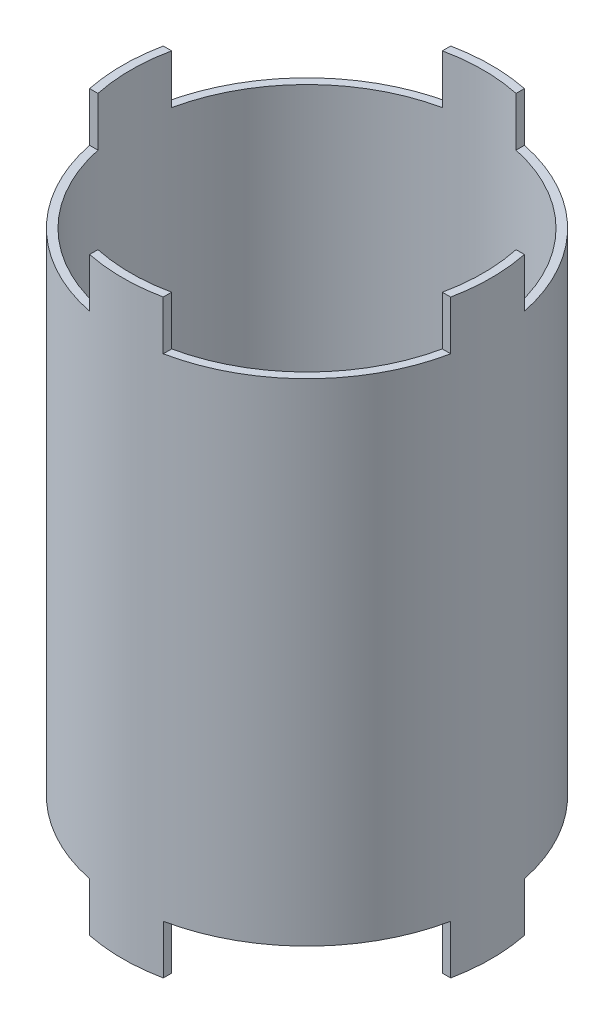
ISO-10303-21;
HEADER;
FILE_DESCRIPTION(('STEP AP214'),'2;1');
FILE_NAME('part.step','',(''),(''),'','','');
FILE_SCHEMA(('AUTOMOTIVE_DESIGN { 1 0 10303 214 1 1 1 1 }'));
ENDSEC;
DATA;
#1=APPLICATION_CONTEXT('core data for automotive mechanical design processes');
#2=APPLICATION_PROTOCOL_DEFINITION('international standard','automotive_design',2000,#1);
#3=PRODUCT_CONTEXT('',#1,'mechanical');
#4=PRODUCT('Part','Part','',(#3));
#5=PRODUCT_RELATED_PRODUCT_CATEGORY('part','',(#4));
#6=PRODUCT_DEFINITION_FORMATION('','',#4);
#7=PRODUCT_DEFINITION_CONTEXT('part definition',#1,'design');
#8=PRODUCT_DEFINITION('design','',#6,#7);
#9=PRODUCT_DEFINITION_SHAPE('','',#8);
#10=(LENGTH_UNIT() NAMED_UNIT(*) SI_UNIT(.MILLI.,.METRE.));
#11=(NAMED_UNIT(*) PLANE_ANGLE_UNIT() SI_UNIT($,.RADIAN.));
#12=(NAMED_UNIT(*) SI_UNIT($,.STERADIAN.) SOLID_ANGLE_UNIT());
#13=UNCERTAINTY_MEASURE_WITH_UNIT(LENGTH_MEASURE(1.E-05),#10,'distance_accuracy_value','');
#14=(GEOMETRIC_REPRESENTATION_CONTEXT(3) GLOBAL_UNCERTAINTY_ASSIGNED_CONTEXT((#13)) GLOBAL_UNIT_ASSIGNED_CONTEXT((#10,
#11,#12)) REPRESENTATION_CONTEXT('',''));
#15=CARTESIAN_POINT('',(0.,0.,0.));
#16=DIRECTION('',(0.,0.,1.));
#17=DIRECTION('',(1.,0.,0.));
#18=AXIS2_PLACEMENT_3D('',#15,#16,#17);
#19=CARTESIAN_POINT('',(0.,0.,0.));
#20=DIRECTION('',(0.,1.,0.));
#21=DIRECTION('',(0.,0.,1.));
#22=AXIS2_PLACEMENT_3D('',#19,#20,#21);
#23=PLANE('',#22);
#24=CARTESIAN_POINT('',(0.,0.,0.));
#25=DIRECTION('',(0.,1.,0.));
#26=DIRECTION('',(0.,0.,1.));
#27=AXIS2_PLACEMENT_3D('',#24,#25,#26);
#28=CIRCLE('',#27,54.61);
#29=CARTESIAN_POINT('',(-53.4004419457367,0.,11.43));
#30=VERTEX_POINT('',#29);
#31=CARTESIAN_POINT('',(-11.43,0.,53.4004419457367));
#32=VERTEX_POINT('',#31);
#33=EDGE_CURVE('E255',#30,#32,#28,.T.);
#34=ORIENTED_EDGE('',*,*,#33,.T.);
#35=DIRECTION('',(0.,0.,1.));
#36=VECTOR('',#35,1.);
#37=CARTESIAN_POINT('',(-11.43,0.,53.4004419457368));
#38=LINE('',#37,#36);
#39=CARTESIAN_POINT('',(-11.43,0.,55.9953355200235));
#40=VERTEX_POINT('',#39);
#41=EDGE_CURVE('E58',#32,#40,#38,.T.);
#42=ORIENTED_EDGE('',*,*,#41,.T.);
#43=CARTESIAN_POINT('',(0.,0.,0.));
#44=DIRECTION('',(0.,1.,0.));
#45=DIRECTION('',(0.,0.,1.));
#46=AXIS2_PLACEMENT_3D('',#43,#44,#45);
#47=CIRCLE('',#46,57.15);
#48=CARTESIAN_POINT('',(-55.9953355200235,0.,11.43));
#49=VERTEX_POINT('',#48);
#50=EDGE_CURVE('E502',#49,#40,#47,.T.);
#51=ORIENTED_EDGE('',*,*,#50,.F.);
#52=DIRECTION('',(1.,0.,0.));
#53=VECTOR('',#52,1.);
#54=CARTESIAN_POINT('',(-55.9953355200235,0.,11.43));
#55=LINE('',#54,#53);
#56=EDGE_CURVE('E327',#49,#30,#55,.T.);
#57=ORIENTED_EDGE('',*,*,#56,.T.);
#58=EDGE_LOOP('',(#34,#42,#51,#57));
#59=FACE_BOUND('',#58,.T.);
#60=ADVANCED_FACE('F33',(#59),#23,.F.);
#61=DIRECTION('',(1.,0.,0.));
#62=VECTOR('',#61,1.);
#63=CARTESIAN_POINT('',(53.4004419457368,0.,-11.43));
#64=LINE('',#63,#62);
#65=CARTESIAN_POINT('',(53.4004419457368,0.,-11.43));
#66=VERTEX_POINT('',#65);
#67=CARTESIAN_POINT('',(55.9953355200235,0.,-11.43));
#68=VERTEX_POINT('',#67);
#69=EDGE_CURVE('E299',#66,#68,#64,.T.);
#70=ORIENTED_EDGE('',*,*,#69,.F.);
#71=CARTESIAN_POINT('',(11.43,0.,-53.4004419457367));
#72=VERTEX_POINT('',#71);
#73=EDGE_CURVE('E256',#66,#72,#28,.T.);
#74=ORIENTED_EDGE('',*,*,#73,.T.);
#75=DIRECTION('',(0.,0.,-1.));
#76=VECTOR('',#75,1.);
#77=CARTESIAN_POINT('',(11.43,0.,-53.4004419457368));
#78=LINE('',#77,#76);
#79=CARTESIAN_POINT('',(11.43,0.,-55.9953355200235));
#80=VERTEX_POINT('',#79);
#81=EDGE_CURVE('E331',#72,#80,#78,.T.);
#82=ORIENTED_EDGE('',*,*,#81,.T.);
#83=EDGE_CURVE('E477',#68,#80,#47,.T.);
#84=ORIENTED_EDGE('',*,*,#83,.F.);
#85=EDGE_LOOP('',(#70,#74,#82,#84));
#86=FACE_BOUND('',#85,.T.);
#87=ADVANCED_FACE('F484',(#86),#23,.F.);
#88=DIRECTION('',(1.,0.,0.));
#89=VECTOR('',#88,1.);
#90=CARTESIAN_POINT('',(-55.9953355200235,0.,-11.43));
#91=LINE('',#90,#89);
#92=CARTESIAN_POINT('',(-55.9953355200235,0.,-11.43));
#93=VERTEX_POINT('',#92);
#94=CARTESIAN_POINT('',(-53.4004419457367,0.,-11.43));
#95=VERTEX_POINT('',#94);
#96=EDGE_CURVE('E324',#93,#95,#91,.T.);
#97=ORIENTED_EDGE('',*,*,#96,.F.);
#98=CARTESIAN_POINT('',(-11.43,0.,-55.9953355200235));
#99=VERTEX_POINT('',#98);
#100=EDGE_CURVE('E37',#99,#93,#47,.T.);
#101=ORIENTED_EDGE('',*,*,#100,.F.);
#102=DIRECTION('',(0.,0.,-1.));
#103=VECTOR('',#102,1.);
#104=CARTESIAN_POINT('',(-11.43,0.,-53.4004419457368));
#105=LINE('',#104,#103);
#106=CARTESIAN_POINT('',(-11.43,0.,-53.4004419457367));
#107=VERTEX_POINT('',#106);
#108=EDGE_CURVE('E344',#107,#99,#105,.T.);
#109=ORIENTED_EDGE('',*,*,#108,.F.);
#110=EDGE_CURVE('E258',#107,#95,#28,.T.);
#111=ORIENTED_EDGE('',*,*,#110,.T.);
#112=EDGE_LOOP('',(#97,#101,#109,#111));
#113=FACE_BOUND('',#112,.T.);
#114=ADVANCED_FACE('F538',(#113),#23,.F.);
#115=CARTESIAN_POINT('',(0.,152.4,0.));
#116=DIRECTION('',(0.,1.,0.));
#117=DIRECTION('',(0.,0.,1.));
#118=AXIS2_PLACEMENT_3D('',#115,#116,#117);
#119=PLANE('',#118);
#120=CARTESIAN_POINT('',(0.,152.4,0.));
#121=DIRECTION('',(0.,1.,0.));
#122=DIRECTION('',(0.,0.,1.));
#123=AXIS2_PLACEMENT_3D('',#120,#121,#122);
#124=CIRCLE('',#123,57.15);
#125=CARTESIAN_POINT('',(-55.9953355200235,152.4,11.43));
#126=VERTEX_POINT('',#125);
#127=CARTESIAN_POINT('',(-11.43,152.4,55.9953355200235));
#128=VERTEX_POINT('',#127);
#129=EDGE_CURVE('E11',#126,#128,#124,.T.);
#130=ORIENTED_EDGE('',*,*,#129,.T.);
#131=DIRECTION('',(0.,0.,1.));
#132=VECTOR('',#131,1.);
#133=CARTESIAN_POINT('',(-11.43,152.4,53.4004419457368));
#134=LINE('',#133,#132);
#135=CARTESIAN_POINT('',(-11.43,152.4,53.4004419457368));
#136=VERTEX_POINT('',#135);
#137=EDGE_CURVE('E379',#136,#128,#134,.T.);
#138=ORIENTED_EDGE('',*,*,#137,.F.);
#139=CARTESIAN_POINT('',(0.,152.4,0.));
#140=DIRECTION('',(0.,1.,0.));
#141=DIRECTION('',(0.,0.,1.));
#142=AXIS2_PLACEMENT_3D('',#139,#140,#141);
#143=CIRCLE('',#142,54.61);
#144=CARTESIAN_POINT('',(-53.4004419457368,152.4,11.43));
#145=VERTEX_POINT('',#144);
#146=EDGE_CURVE('E475',#145,#136,#143,.T.);
#147=ORIENTED_EDGE('',*,*,#146,.F.);
#148=DIRECTION('',(-1.,0.,0.));
#149=VECTOR('',#148,1.);
#150=CARTESIAN_POINT('',(-53.4004419457368,152.4,11.43));
#151=LINE('',#150,#149);
#152=EDGE_CURVE('E452',#145,#126,#151,.T.);
#153=ORIENTED_EDGE('',*,*,#152,.T.);
#154=EDGE_LOOP('',(#130,#138,#147,#153));
#155=FACE_BOUND('',#154,.T.);
#156=ADVANCED_FACE('F549',(#155),#119,.T.);
#157=DIRECTION('',(-0.00627212040273388,0.,0.999980330059374));
#158=VECTOR('',#157,1.);
#159=CARTESIAN_POINT('',(11.43,152.4,53.4004419457368));
#160=LINE('',#159,#158);
#161=CARTESIAN_POINT('',(11.43,152.4,53.4004419457367));
#162=VERTEX_POINT('',#161);
#163=CARTESIAN_POINT('',(11.4137033455449,152.4,55.9986595905643));
#164=VERTEX_POINT('',#163);
#165=EDGE_CURVE('E381',#162,#164,#160,.T.);
#166=ORIENTED_EDGE('',*,*,#165,.T.);
#167=CARTESIAN_POINT('',(55.9953355200235,152.4,11.43));
#168=VERTEX_POINT('',#167);
#169=EDGE_CURVE('E42',#164,#168,#124,.T.);
#170=ORIENTED_EDGE('',*,*,#169,.T.);
#171=DIRECTION('',(1.,0.,0.));
#172=VECTOR('',#171,1.);
#173=CARTESIAN_POINT('',(53.4004419457368,152.4,11.43));
#174=LINE('',#173,#172);
#175=CARTESIAN_POINT('',(53.4004419457368,152.4,11.43));
#176=VERTEX_POINT('',#175);
#177=EDGE_CURVE('E405',#176,#168,#174,.T.);
#178=ORIENTED_EDGE('',*,*,#177,.F.);
#179=EDGE_CURVE('E478',#162,#176,#143,.T.);
#180=ORIENTED_EDGE('',*,*,#179,.F.);
#181=EDGE_LOOP('',(#166,#170,#178,#180));
#182=FACE_BOUND('',#181,.T.);
#183=ADVANCED_FACE('F554',(#182),#119,.T.);
#184=DIRECTION('',(1.,0.,0.));
#185=VECTOR('',#184,1.);
#186=CARTESIAN_POINT('',(53.4004419457368,152.4,-11.43));
#187=LINE('',#186,#185);
#188=CARTESIAN_POINT('',(53.4004419457367,152.4,-11.43));
#189=VERTEX_POINT('',#188);
#190=CARTESIAN_POINT('',(55.9953355200235,152.4,-11.43));
#191=VERTEX_POINT('',#190);
#192=EDGE_CURVE('E408',#189,#191,#187,.T.);
#193=ORIENTED_EDGE('',*,*,#192,.T.);
#194=CARTESIAN_POINT('',(11.43,152.4,-55.9953355200235));
#195=VERTEX_POINT('',#194);
#196=EDGE_CURVE('E879',#191,#195,#124,.T.);
#197=ORIENTED_EDGE('',*,*,#196,.T.);
#198=DIRECTION('',(0.,0.,-1.));
#199=VECTOR('',#198,1.);
#200=CARTESIAN_POINT('',(11.43,152.4,-53.4004419457368));
#201=LINE('',#200,#199);
#202=CARTESIAN_POINT('',(11.43,152.4,-53.4004419457368));
#203=VERTEX_POINT('',#202);
#204=EDGE_CURVE('E432',#203,#195,#201,.T.);
#205=ORIENTED_EDGE('',*,*,#204,.F.);
#206=EDGE_CURVE('E481',#189,#203,#143,.T.);
#207=ORIENTED_EDGE('',*,*,#206,.F.);
#208=EDGE_LOOP('',(#193,#197,#205,#207));
#209=FACE_BOUND('',#208,.T.);
#210=ADVANCED_FACE('F547',(#209),#119,.T.);
#211=DIRECTION('',(0.,0.,-1.));
#212=VECTOR('',#211,1.);
#213=CARTESIAN_POINT('',(-11.43,152.4,-53.4004419457368));
#214=LINE('',#213,#212);
#215=CARTESIAN_POINT('',(-11.43,152.4,-53.4004419457367));
#216=VERTEX_POINT('',#215);
#217=CARTESIAN_POINT('',(-11.43,152.4,-55.9953355200235));
#218=VERTEX_POINT('',#217);
#219=EDGE_CURVE('E435',#216,#218,#214,.T.);
#220=ORIENTED_EDGE('',*,*,#219,.T.);
#221=CARTESIAN_POINT('',(-55.9953355200235,152.4,-11.43));
#222=VERTEX_POINT('',#221);
#223=EDGE_CURVE('E43',#218,#222,#124,.T.);
#224=ORIENTED_EDGE('',*,*,#223,.T.);
#225=DIRECTION('',(1.,0.,0.));
#226=VECTOR('',#225,1.);
#227=CARTESIAN_POINT('',(-55.9953355200235,152.4,-11.43));
#228=LINE('',#227,#226);
#229=CARTESIAN_POINT('',(-53.4004419457368,152.4,-11.43));
#230=VERTEX_POINT('',#229);
#231=EDGE_CURVE('E439',#222,#230,#228,.T.);
#232=ORIENTED_EDGE('',*,*,#231,.T.);
#233=EDGE_CURVE('E479',#216,#230,#143,.T.);
#234=ORIENTED_EDGE('',*,*,#233,.F.);
#235=EDGE_LOOP('',(#220,#224,#232,#234));
#236=FACE_BOUND('',#235,.T.);
#237=ADVANCED_FACE('F541',(#236),#119,.T.);
#238=CARTESIAN_POINT('',(11.43,0.,55.9953355200235));
#239=VERTEX_POINT('',#238);
#240=CARTESIAN_POINT('',(55.9953355200235,0.,11.43));
#241=VERTEX_POINT('',#240);
#242=EDGE_CURVE('E50',#239,#241,#47,.T.);
#243=ORIENTED_EDGE('',*,*,#242,.F.);
#244=DIRECTION('',(0.,0.,-1.));
#245=VECTOR('',#244,1.);
#246=CARTESIAN_POINT('',(11.43,0.,55.9953355200235));
#247=LINE('',#246,#245);
#248=CARTESIAN_POINT('',(11.43,0.,53.4004419457368));
#249=VERTEX_POINT('',#248);
#250=EDGE_CURVE('E260',#239,#249,#247,.T.);
#251=ORIENTED_EDGE('',*,*,#250,.T.);
#252=CARTESIAN_POINT('',(53.4004419457367,0.,11.43));
#253=VERTEX_POINT('',#252);
#254=EDGE_CURVE('E245',#249,#253,#28,.T.);
#255=ORIENTED_EDGE('',*,*,#254,.T.);
#256=DIRECTION('',(1.,0.,0.));
#257=VECTOR('',#256,1.);
#258=CARTESIAN_POINT('',(53.4004419457368,0.,11.43));
#259=LINE('',#258,#257);
#260=EDGE_CURVE('E297',#253,#241,#259,.T.);
#261=ORIENTED_EDGE('',*,*,#260,.T.);
#262=EDGE_LOOP('',(#243,#251,#255,#261));
#263=FACE_BOUND('',#262,.T.);
#264=ADVANCED_FACE('F261',(#263),#23,.F.);
#265=CARTESIAN_POINT('',(0.,152.4,0.));
#266=DIRECTION('',(0.,-1.,0.));
#267=DIRECTION('',(0.,0.,-1.));
#268=AXIS2_PLACEMENT_3D('',#265,#266,#267);
#269=CYLINDRICAL_SURFACE('',#268,57.15);
#270=ORIENTED_EDGE('',*,*,#129,.F.);
#271=DIRECTION('',(0.,-1.,0.));
#272=VECTOR('',#271,1.);
#273=CARTESIAN_POINT('',(-55.9953355200235,167.64,11.43));
#274=LINE('',#273,#272);
#275=CARTESIAN_POINT('',(-55.9953355200235,167.64,11.43));
#276=VERTEX_POINT('',#275);
#277=EDGE_CURVE('E469',#276,#126,#274,.T.);
#278=ORIENTED_EDGE('',*,*,#277,.F.);
#279=CARTESIAN_POINT('',(0.,167.64,0.));
#280=DIRECTION('',(0.,-1.,0.));
#281=DIRECTION('',(0.,0.,-1.));
#282=AXIS2_PLACEMENT_3D('',#279,#280,#281);
#283=CIRCLE('',#282,57.15);
#284=CARTESIAN_POINT('',(-55.9953355200235,167.64,-11.43));
#285=VERTEX_POINT('',#284);
#286=EDGE_CURVE('E458',#276,#285,#283,.T.);
#287=ORIENTED_EDGE('',*,*,#286,.T.);
#288=DIRECTION('',(0.,-1.,0.));
#289=VECTOR('',#288,1.);
#290=CARTESIAN_POINT('',(-55.9953355200235,167.64,-11.43));
#291=LINE('',#290,#289);
#292=EDGE_CURVE('E466',#285,#222,#291,.T.);
#293=ORIENTED_EDGE('',*,*,#292,.T.);
#294=ORIENTED_EDGE('',*,*,#223,.F.);
#295=DIRECTION('',(0.,-1.,0.));
#296=VECTOR('',#295,1.);
#297=CARTESIAN_POINT('',(-11.43,167.64,-55.9953355200235));
#298=LINE('',#297,#296);
#299=CARTESIAN_POINT('',(-11.43,167.64,-55.9953355200235));
#300=VERTEX_POINT('',#299);
#301=EDGE_CURVE('E421',#300,#218,#298,.T.);
#302=ORIENTED_EDGE('',*,*,#301,.F.);
#303=CARTESIAN_POINT('',(0.,167.64,0.));
#304=DIRECTION('',(0.,-1.,0.));
#305=DIRECTION('',(0.,0.,-1.));
#306=AXIS2_PLACEMENT_3D('',#303,#304,#305);
#307=CIRCLE('',#306,57.15);
#308=CARTESIAN_POINT('',(11.43,167.64,-55.9953355200235));
#309=VERTEX_POINT('',#308);
#310=EDGE_CURVE('E443',#300,#309,#307,.T.);
#311=ORIENTED_EDGE('',*,*,#310,.T.);
#312=DIRECTION('',(0.,-1.,0.));
#313=VECTOR('',#312,1.);
#314=CARTESIAN_POINT('',(11.43,167.64,-55.9953355200235));
#315=LINE('',#314,#313);
#316=EDGE_CURVE('E424',#309,#195,#315,.T.);
#317=ORIENTED_EDGE('',*,*,#316,.T.);
#318=ORIENTED_EDGE('',*,*,#196,.F.);
#319=DIRECTION('',(0.,-1.,0.));
#320=VECTOR('',#319,1.);
#321=CARTESIAN_POINT('',(55.9953355200235,167.64,-11.43));
#322=LINE('',#321,#320);
#323=CARTESIAN_POINT('',(55.9953355200235,167.64,-11.43));
#324=VERTEX_POINT('',#323);
#325=EDGE_CURVE('E394',#324,#191,#322,.T.);
#326=ORIENTED_EDGE('',*,*,#325,.F.);
#327=CARTESIAN_POINT('',(0.,167.64,0.));
#328=DIRECTION('',(0.,-1.,0.));
#329=DIRECTION('',(0.,0.,-1.));
#330=AXIS2_PLACEMENT_3D('',#327,#328,#329);
#331=CIRCLE('',#330,57.15);
#332=CARTESIAN_POINT('',(55.9953355200235,167.64,11.43));
#333=VERTEX_POINT('',#332);
#334=EDGE_CURVE('E416',#324,#333,#331,.T.);
#335=ORIENTED_EDGE('',*,*,#334,.T.);
#336=DIRECTION('',(0.,-1.,0.));
#337=VECTOR('',#336,1.);
#338=CARTESIAN_POINT('',(55.9953355200235,167.64,11.43));
#339=LINE('',#338,#337);
#340=EDGE_CURVE('E397',#333,#168,#339,.T.);
#341=ORIENTED_EDGE('',*,*,#340,.T.);
#342=ORIENTED_EDGE('',*,*,#169,.F.);
#343=DIRECTION('',(0.,-1.,0.));
#344=VECTOR('',#343,1.);
#345=CARTESIAN_POINT('',(11.4137033455449,167.64,55.9986595905643));
#346=LINE('',#345,#344);
#347=CARTESIAN_POINT('',(11.4137033455449,167.64,55.9986595905643));
#348=VERTEX_POINT('',#347);
#349=EDGE_CURVE('E373',#348,#164,#346,.T.);
#350=ORIENTED_EDGE('',*,*,#349,.F.);
#351=CARTESIAN_POINT('',(0.,167.64,0.));
#352=DIRECTION('',(0.,1.,0.));
#353=DIRECTION('',(0.,0.,1.));
#354=AXIS2_PLACEMENT_3D('',#351,#352,#353);
#355=CIRCLE('',#354,57.15);
#356=CARTESIAN_POINT('',(-11.43,167.64,55.9953355200235));
#357=VERTEX_POINT('',#356);
#358=EDGE_CURVE('E387',#357,#348,#355,.T.);
#359=ORIENTED_EDGE('',*,*,#358,.F.);
#360=DIRECTION('',(0.,-1.,0.));
#361=VECTOR('',#360,1.);
#362=CARTESIAN_POINT('',(-11.43,167.64,55.9953355200235));
#363=LINE('',#362,#361);
#364=EDGE_CURVE('E375',#357,#128,#363,.T.);
#365=ORIENTED_EDGE('',*,*,#364,.T.);
#366=EDGE_LOOP('',(#270,#278,#287,#293,#294,#302,#311,#317,#318,#326,#335,#341,#342,#350,#359,#365));
#367=FACE_BOUND('',#366,.T.);
#368=ORIENTED_EDGE('',*,*,#100,.T.);
#369=DIRECTION('',(0.,1.,0.));
#370=VECTOR('',#369,1.);
#371=CARTESIAN_POINT('',(-55.9953355200235,-15.24,-11.43));
#372=LINE('',#371,#370);
#373=CARTESIAN_POINT('',(-55.9953355200235,-15.24,-11.43));
#374=VERTEX_POINT('',#373);
#375=EDGE_CURVE('E319',#374,#93,#372,.T.);
#376=ORIENTED_EDGE('',*,*,#375,.F.);
#377=CARTESIAN_POINT('',(0.,-15.24,0.));
#378=DIRECTION('',(0.,-1.,0.));
#379=DIRECTION('',(0.,0.,-1.));
#380=AXIS2_PLACEMENT_3D('',#377,#378,#379);
#381=CIRCLE('',#380,57.15);
#382=CARTESIAN_POINT('',(-55.9953355200235,-15.24,11.43));
#383=VERTEX_POINT('',#382);
#384=EDGE_CURVE('E315',#383,#374,#381,.T.);
#385=ORIENTED_EDGE('',*,*,#384,.F.);
#386=DIRECTION('',(0.,1.,0.));
#387=VECTOR('',#386,1.);
#388=CARTESIAN_POINT('',(-55.9953355200235,-15.24,11.43));
#389=LINE('',#388,#387);
#390=EDGE_CURVE('E303',#383,#49,#389,.T.);
#391=ORIENTED_EDGE('',*,*,#390,.T.);
#392=ORIENTED_EDGE('',*,*,#50,.T.);
#393=DIRECTION('',(0.,1.,0.));
#394=VECTOR('',#393,1.);
#395=CARTESIAN_POINT('',(-11.43,-15.24,55.9953355200235));
#396=LINE('',#395,#394);
#397=CARTESIAN_POINT('',(-11.43,-15.24,55.9953355200235));
#398=VERTEX_POINT('',#397);
#399=EDGE_CURVE('E271',#398,#40,#396,.T.);
#400=ORIENTED_EDGE('',*,*,#399,.F.);
#401=CARTESIAN_POINT('',(0.,-15.24,0.));
#402=DIRECTION('',(0.,1.,0.));
#403=DIRECTION('',(0.,0.,1.));
#404=AXIS2_PLACEMENT_3D('',#401,#402,#403);
#405=CIRCLE('',#404,57.15);
#406=CARTESIAN_POINT('',(11.43,-15.24,55.9953355200235));
#407=VERTEX_POINT('',#406);
#408=EDGE_CURVE('E282',#398,#407,#405,.T.);
#409=ORIENTED_EDGE('',*,*,#408,.T.);
#410=DIRECTION('',(0.,1.,0.));
#411=VECTOR('',#410,1.);
#412=CARTESIAN_POINT('',(11.43,-15.24,55.9953355200235));
#413=LINE('',#412,#411);
#414=EDGE_CURVE('E268',#407,#239,#413,.T.);
#415=ORIENTED_EDGE('',*,*,#414,.T.);
#416=ORIENTED_EDGE('',*,*,#242,.T.);
#417=DIRECTION('',(0.,1.,0.));
#418=VECTOR('',#417,1.);
#419=CARTESIAN_POINT('',(55.9953355200235,-15.24,11.43));
#420=LINE('',#419,#418);
#421=CARTESIAN_POINT('',(55.9953355200235,-15.24,11.43));
#422=VERTEX_POINT('',#421);
#423=EDGE_CURVE('E289',#422,#241,#420,.T.);
#424=ORIENTED_EDGE('',*,*,#423,.F.);
#425=CARTESIAN_POINT('',(0.,-15.24,0.));
#426=DIRECTION('',(0.,-1.,0.));
#427=DIRECTION('',(0.,0.,-1.));
#428=AXIS2_PLACEMENT_3D('',#425,#426,#427);
#429=CIRCLE('',#428,57.15);
#430=CARTESIAN_POINT('',(55.9953355200235,-15.24,-11.43));
#431=VERTEX_POINT('',#430);
#432=EDGE_CURVE('E308',#431,#422,#429,.T.);
#433=ORIENTED_EDGE('',*,*,#432,.F.);
#434=DIRECTION('',(0.,1.,0.));
#435=VECTOR('',#434,1.);
#436=CARTESIAN_POINT('',(55.9953355200235,-15.24,-11.43));
#437=LINE('',#436,#435);
#438=EDGE_CURVE('E278',#431,#68,#437,.T.);
#439=ORIENTED_EDGE('',*,*,#438,.T.);
#440=ORIENTED_EDGE('',*,*,#83,.T.);
#441=DIRECTION('',(0.,1.,0.));
#442=VECTOR('',#441,1.);
#443=CARTESIAN_POINT('',(11.43,-15.24,-55.9953355200235));
#444=LINE('',#443,#442);
#445=CARTESIAN_POINT('',(11.43,-15.24,-55.9953355200235));
#446=VERTEX_POINT('',#445);
#447=EDGE_CURVE('E352',#446,#80,#444,.T.);
#448=ORIENTED_EDGE('',*,*,#447,.F.);
#449=CARTESIAN_POINT('',(0.,-15.24,0.));
#450=DIRECTION('',(0.,1.,0.));
#451=DIRECTION('',(0.,0.,1.));
#452=AXIS2_PLACEMENT_3D('',#449,#450,#451);
#453=CIRCLE('',#452,57.15);
#454=CARTESIAN_POINT('',(-11.43,-15.24,-55.9953355200235));
#455=VERTEX_POINT('',#454);
#456=EDGE_CURVE('E343',#446,#455,#453,.T.);
#457=ORIENTED_EDGE('',*,*,#456,.T.);
#458=DIRECTION('',(0.,1.,0.));
#459=VECTOR('',#458,1.);
#460=CARTESIAN_POINT('',(-11.43,-15.24,-55.9953355200235));
#461=LINE('',#460,#459);
#462=EDGE_CURVE('E364',#455,#99,#461,.T.);
#463=ORIENTED_EDGE('',*,*,#462,.T.);
#464=EDGE_LOOP('',(#368,#376,#385,#391,#392,#400,#409,#415,#416,#424,#433,#439,#440,#448,#457,#463));
#465=FACE_BOUND('',#464,.T.);
#466=ADVANCED_FACE('F35',(#367,#465),#269,.T.);
#467=CARTESIAN_POINT('',(0.,152.4,0.));
#468=DIRECTION('',(0.,-1.,0.));
#469=DIRECTION('',(0.,0.,-1.));
#470=AXIS2_PLACEMENT_3D('',#467,#468,#469);
#471=CYLINDRICAL_SURFACE('',#470,54.61);
#472=ORIENTED_EDGE('',*,*,#146,.T.);
#473=DIRECTION('',(0.,-1.,0.));
#474=VECTOR('',#473,1.);
#475=CARTESIAN_POINT('',(-11.43,167.64,53.4004419457368));
#476=LINE('',#475,#474);
#477=CARTESIAN_POINT('',(-11.43,167.64,53.4004419457368));
#478=VERTEX_POINT('',#477);
#479=EDGE_CURVE('E360',#478,#136,#476,.T.);
#480=ORIENTED_EDGE('',*,*,#479,.F.);
#481=CARTESIAN_POINT('',(0.,167.64,0.));
#482=DIRECTION('',(0.,1.,0.));
#483=DIRECTION('',(0.,0.,1.));
#484=AXIS2_PLACEMENT_3D('',#481,#482,#483);
#485=CIRCLE('',#484,54.61);
#486=CARTESIAN_POINT('',(11.43,167.64,53.4004419457368));
#487=VERTEX_POINT('',#486);
#488=EDGE_CURVE('E382',#478,#487,#485,.T.);
#489=ORIENTED_EDGE('',*,*,#488,.T.);
#490=DIRECTION('',(0.,-1.,0.));
#491=VECTOR('',#490,1.);
#492=CARTESIAN_POINT('',(11.43,167.64,53.4004419457368));
#493=LINE('',#492,#491);
#494=EDGE_CURVE('E369',#487,#162,#493,.T.);
#495=ORIENTED_EDGE('',*,*,#494,.T.);
#496=ORIENTED_EDGE('',*,*,#179,.T.);
#497=DIRECTION('',(0.,-1.,0.));
#498=VECTOR('',#497,1.);
#499=CARTESIAN_POINT('',(53.4004419457368,167.64,11.43));
#500=LINE('',#499,#498);
#501=CARTESIAN_POINT('',(53.4004419457368,167.64,11.43));
#502=VERTEX_POINT('',#501);
#503=EDGE_CURVE('E400',#502,#176,#500,.T.);
#504=ORIENTED_EDGE('',*,*,#503,.F.);
#505=CARTESIAN_POINT('',(0.,167.64,0.));
#506=DIRECTION('',(0.,-1.,0.));
#507=DIRECTION('',(0.,0.,-1.));
#508=AXIS2_PLACEMENT_3D('',#505,#506,#507);
#509=CIRCLE('',#508,54.61);
#510=CARTESIAN_POINT('',(53.4004419457368,167.64,-11.43));
#511=VERTEX_POINT('',#510);
#512=EDGE_CURVE('E396',#511,#502,#509,.T.);
#513=ORIENTED_EDGE('',*,*,#512,.F.);
#514=DIRECTION('',(0.,-1.,0.));
#515=VECTOR('',#514,1.);
#516=CARTESIAN_POINT('',(53.4004419457368,167.64,-11.43));
#517=LINE('',#516,#515);
#518=EDGE_CURVE('E385',#511,#189,#517,.T.);
#519=ORIENTED_EDGE('',*,*,#518,.T.);
#520=ORIENTED_EDGE('',*,*,#206,.T.);
#521=DIRECTION('',(0.,-1.,0.));
#522=VECTOR('',#521,1.);
#523=CARTESIAN_POINT('',(11.43,167.64,-53.4004419457368));
#524=LINE('',#523,#522);
#525=CARTESIAN_POINT('',(11.43,167.64,-53.4004419457368));
#526=VERTEX_POINT('',#525);
#527=EDGE_CURVE('E427',#526,#203,#524,.T.);
#528=ORIENTED_EDGE('',*,*,#527,.F.);
#529=CARTESIAN_POINT('',(0.,167.64,0.));
#530=DIRECTION('',(0.,-1.,0.));
#531=DIRECTION('',(0.,0.,-1.));
#532=AXIS2_PLACEMENT_3D('',#529,#530,#531);
#533=CIRCLE('',#532,54.61);
#534=CARTESIAN_POINT('',(-11.43,167.64,-53.4004419457368));
#535=VERTEX_POINT('',#534);
#536=EDGE_CURVE('E423',#535,#526,#533,.T.);
#537=ORIENTED_EDGE('',*,*,#536,.F.);
#538=DIRECTION('',(0.,-1.,0.));
#539=VECTOR('',#538,1.);
#540=CARTESIAN_POINT('',(-11.43,167.64,-53.4004419457368));
#541=LINE('',#540,#539);
#542=EDGE_CURVE('E412',#535,#216,#541,.T.);
#543=ORIENTED_EDGE('',*,*,#542,.T.);
#544=ORIENTED_EDGE('',*,*,#233,.T.);
#545=DIRECTION('',(0.,-1.,0.));
#546=VECTOR('',#545,1.);
#547=CARTESIAN_POINT('',(-53.4004419457368,167.64,-11.43));
#548=LINE('',#547,#546);
#549=CARTESIAN_POINT('',(-53.4004419457368,167.64,-11.43));
#550=VERTEX_POINT('',#549);
#551=EDGE_CURVE('E461',#550,#230,#548,.T.);
#552=ORIENTED_EDGE('',*,*,#551,.F.);
#553=CARTESIAN_POINT('',(0.,167.64,0.));
#554=DIRECTION('',(0.,1.,0.));
#555=DIRECTION('',(0.,0.,1.));
#556=AXIS2_PLACEMENT_3D('',#553,#554,#555);
#557=CIRCLE('',#556,54.61);
#558=CARTESIAN_POINT('',(-53.4004419457368,167.64,11.43));
#559=VERTEX_POINT('',#558);
#560=EDGE_CURVE('E451',#550,#559,#557,.T.);
#561=ORIENTED_EDGE('',*,*,#560,.T.);
#562=DIRECTION('',(0.,-1.,0.));
#563=VECTOR('',#562,1.);
#564=CARTESIAN_POINT('',(-53.4004419457368,167.64,11.43));
#565=LINE('',#564,#563);
#566=EDGE_CURVE('E471',#559,#145,#565,.T.);
#567=ORIENTED_EDGE('',*,*,#566,.T.);
#568=EDGE_LOOP('',(#472,#480,#489,#495,#496,#504,#513,#519,#520,#528,#537,#543,#544,#552,#561,#567));
#569=FACE_BOUND('',#568,.T.);
#570=ORIENTED_EDGE('',*,*,#110,.F.);
#571=DIRECTION('',(0.,1.,0.));
#572=VECTOR('',#571,1.);
#573=CARTESIAN_POINT('',(-11.43,-15.24,-53.4004419457368));
#574=LINE('',#573,#572);
#575=CARTESIAN_POINT('',(-11.43,-15.24,-53.4004419457368));
#576=VERTEX_POINT('',#575);
#577=EDGE_CURVE('E361',#576,#107,#574,.T.);
#578=ORIENTED_EDGE('',*,*,#577,.F.);
#579=CARTESIAN_POINT('',(0.,-15.24,0.));
#580=DIRECTION('',(0.,-1.,0.));
#581=DIRECTION('',(0.,0.,-1.));
#582=AXIS2_PLACEMENT_3D('',#579,#580,#581);
#583=CIRCLE('',#582,54.61);
#584=CARTESIAN_POINT('',(11.43,-15.24,-53.4004419457368));
#585=VERTEX_POINT('',#584);
#586=EDGE_CURVE('E349',#576,#585,#583,.T.);
#587=ORIENTED_EDGE('',*,*,#586,.T.);
#588=DIRECTION('',(0.,1.,0.));
#589=VECTOR('',#588,1.);
#590=CARTESIAN_POINT('',(11.43,-15.24,-53.4004419457368));
#591=LINE('',#590,#589);
#592=EDGE_CURVE('E357',#585,#72,#591,.T.);
#593=ORIENTED_EDGE('',*,*,#592,.T.);
#594=ORIENTED_EDGE('',*,*,#73,.F.);
#595=DIRECTION('',(0.,1.,0.));
#596=VECTOR('',#595,1.);
#597=CARTESIAN_POINT('',(53.4004419457368,-15.24,-11.43));
#598=LINE('',#597,#596);
#599=CARTESIAN_POINT('',(53.4004419457368,-15.24,-11.43));
#600=VERTEX_POINT('',#599);
#601=EDGE_CURVE('E293',#600,#66,#598,.T.);
#602=ORIENTED_EDGE('',*,*,#601,.F.);
#603=CARTESIAN_POINT('',(0.,-15.24,0.));
#604=DIRECTION('',(0.,-1.,0.));
#605=DIRECTION('',(0.,0.,-1.));
#606=AXIS2_PLACEMENT_3D('',#603,#604,#605);
#607=CIRCLE('',#606,54.61);
#608=CARTESIAN_POINT('',(53.4004419457368,-15.24,11.43));
#609=VERTEX_POINT('',#608);
#610=EDGE_CURVE('E296',#600,#609,#607,.T.);
#611=ORIENTED_EDGE('',*,*,#610,.T.);
#612=DIRECTION('',(0.,1.,0.));
#613=VECTOR('',#612,1.);
#614=CARTESIAN_POINT('',(53.4004419457368,-15.24,11.43));
#615=LINE('',#614,#613);
#616=EDGE_CURVE('E253',#609,#253,#615,.T.);
#617=ORIENTED_EDGE('',*,*,#616,.T.);
#618=ORIENTED_EDGE('',*,*,#254,.F.);
#619=DIRECTION('',(0.,1.,0.));
#620=VECTOR('',#619,1.);
#621=CARTESIAN_POINT('',(11.43,-15.24,53.4004419457368));
#622=LINE('',#621,#620);
#623=CARTESIAN_POINT('',(11.43,-15.24,53.4004419457368));
#624=VERTEX_POINT('',#623);
#625=EDGE_CURVE('E250',#624,#249,#622,.T.);
#626=ORIENTED_EDGE('',*,*,#625,.F.);
#627=CARTESIAN_POINT('',(0.,-15.24,0.));
#628=DIRECTION('',(0.,1.,0.));
#629=DIRECTION('',(0.,0.,1.));
#630=AXIS2_PLACEMENT_3D('',#627,#628,#629);
#631=CIRCLE('',#630,54.61);
#632=CARTESIAN_POINT('',(-11.43,-15.24,53.4004419457368));
#633=VERTEX_POINT('',#632);
#634=EDGE_CURVE('E279',#633,#624,#631,.T.);
#635=ORIENTED_EDGE('',*,*,#634,.F.);
#636=DIRECTION('',(0.,1.,0.));
#637=VECTOR('',#636,1.);
#638=CARTESIAN_POINT('',(-11.43,-15.24,53.4004419457368));
#639=LINE('',#638,#637);
#640=EDGE_CURVE('E269',#633,#32,#639,.T.);
#641=ORIENTED_EDGE('',*,*,#640,.T.);
#642=ORIENTED_EDGE('',*,*,#33,.F.);
#643=DIRECTION('',(0.,1.,0.));
#644=VECTOR('',#643,1.);
#645=CARTESIAN_POINT('',(-53.4004419457367,-15.24,11.43));
#646=LINE('',#645,#644);
#647=CARTESIAN_POINT('',(-53.4004419457367,-15.24,11.43));
#648=VERTEX_POINT('',#647);
#649=EDGE_CURVE('E312',#648,#30,#646,.T.);
#650=ORIENTED_EDGE('',*,*,#649,.F.);
#651=CARTESIAN_POINT('',(0.,-15.24,0.));
#652=DIRECTION('',(0.,-1.,0.));
#653=DIRECTION('',(0.,0.,-1.));
#654=AXIS2_PLACEMENT_3D('',#651,#652,#653);
#655=CIRCLE('',#654,54.61);
#656=CARTESIAN_POINT('',(-53.4004419457367,-15.24,-11.43));
#657=VERTEX_POINT('',#656);
#658=EDGE_CURVE('E335',#648,#657,#655,.T.);
#659=ORIENTED_EDGE('',*,*,#658,.T.);
#660=DIRECTION('',(0.,1.,0.));
#661=VECTOR('',#660,1.);
#662=CARTESIAN_POINT('',(-53.4004419457367,-15.24,-11.43));
#663=LINE('',#662,#661);
#664=EDGE_CURVE('E316',#657,#95,#663,.T.);
#665=ORIENTED_EDGE('',*,*,#664,.T.);
#666=EDGE_LOOP('',(#570,#578,#587,#593,#594,#602,#611,#617,#618,#626,#635,#641,#642,#650,#659,#665));
#667=FACE_BOUND('',#666,.T.);
#668=ADVANCED_FACE('F247',(#569,#667),#471,.F.);
#669=CARTESIAN_POINT('',(-55.9953355200235,167.64,-11.43));
#670=DIRECTION('',(0.,0.,-1.));
#671=DIRECTION('',(-1.,0.,0.));
#672=AXIS2_PLACEMENT_3D('',#669,#670,#671);
#673=PLANE('',#672);
#674=ORIENTED_EDGE('',*,*,#231,.F.);
#675=ORIENTED_EDGE('',*,*,#292,.F.);
#676=DIRECTION('',(1.,0.,0.));
#677=VECTOR('',#676,1.);
#678=CARTESIAN_POINT('',(-55.9953355200235,167.64,-11.43));
#679=LINE('',#678,#677);
#680=EDGE_CURVE('E448',#285,#550,#679,.T.);
#681=ORIENTED_EDGE('',*,*,#680,.T.);
#682=ORIENTED_EDGE('',*,*,#551,.T.);
#683=EDGE_LOOP('',(#674,#675,#681,#682));
#684=FACE_BOUND('',#683,.T.);
#685=ADVANCED_FACE('F563',(#684),#673,.T.);
#686=CARTESIAN_POINT('',(-53.4004419457368,167.64,11.43));
#687=DIRECTION('',(0.,0.,1.));
#688=DIRECTION('',(1.,0.,0.));
#689=AXIS2_PLACEMENT_3D('',#686,#687,#688);
#690=PLANE('',#689);
#691=ORIENTED_EDGE('',*,*,#152,.F.);
#692=ORIENTED_EDGE('',*,*,#566,.F.);
#693=DIRECTION('',(-1.,0.,0.));
#694=VECTOR('',#693,1.);
#695=CARTESIAN_POINT('',(-53.4004419457368,167.64,11.43));
#696=LINE('',#695,#694);
#697=EDGE_CURVE('E455',#559,#276,#696,.T.);
#698=ORIENTED_EDGE('',*,*,#697,.T.);
#699=ORIENTED_EDGE('',*,*,#277,.T.);
#700=EDGE_LOOP('',(#691,#692,#698,#699));
#701=FACE_BOUND('',#700,.T.);
#702=ADVANCED_FACE('F567',(#701),#690,.T.);
#703=CARTESIAN_POINT('',(0.,167.64,0.));
#704=DIRECTION('',(0.,1.,0.));
#705=DIRECTION('',(0.,0.,1.));
#706=AXIS2_PLACEMENT_3D('',#703,#704,#705);
#707=PLANE('',#706);
#708=ORIENTED_EDGE('',*,*,#680,.F.);
#709=ORIENTED_EDGE('',*,*,#286,.F.);
#710=ORIENTED_EDGE('',*,*,#697,.F.);
#711=ORIENTED_EDGE('',*,*,#560,.F.);
#712=EDGE_LOOP('',(#708,#709,#710,#711));
#713=FACE_BOUND('',#712,.T.);
#714=ADVANCED_FACE('F571',(#713),#707,.T.);
#715=CARTESIAN_POINT('',(-11.43,167.64,-53.4004419457368));
#716=DIRECTION('',(-1.,0.,0.));
#717=DIRECTION('',(0.,0.,1.));
#718=AXIS2_PLACEMENT_3D('',#715,#716,#717);
#719=PLANE('',#718);
#720=ORIENTED_EDGE('',*,*,#219,.F.);
#721=ORIENTED_EDGE('',*,*,#542,.F.);
#722=DIRECTION('',(0.,0.,-1.));
#723=VECTOR('',#722,1.);
#724=CARTESIAN_POINT('',(-11.43,167.64,-53.4004419457368));
#725=LINE('',#724,#723);
#726=EDGE_CURVE('E436',#535,#300,#725,.T.);
#727=ORIENTED_EDGE('',*,*,#726,.T.);
#728=ORIENTED_EDGE('',*,*,#301,.T.);
#729=EDGE_LOOP('',(#720,#721,#727,#728));
#730=FACE_BOUND('',#729,.T.);
#731=ADVANCED_FACE('F575',(#730),#719,.T.);
#732=CARTESIAN_POINT('',(11.43,167.64,-53.4004419457368));
#733=DIRECTION('',(-1.,0.,0.));
#734=DIRECTION('',(0.,0.,1.));
#735=AXIS2_PLACEMENT_3D('',#732,#733,#734);
#736=PLANE('',#735);
#737=ORIENTED_EDGE('',*,*,#204,.T.);
#738=ORIENTED_EDGE('',*,*,#316,.F.);
#739=DIRECTION('',(0.,0.,-1.));
#740=VECTOR('',#739,1.);
#741=CARTESIAN_POINT('',(11.43,167.64,-53.4004419457368));
#742=LINE('',#741,#740);
#743=EDGE_CURVE('E441',#526,#309,#742,.T.);
#744=ORIENTED_EDGE('',*,*,#743,.F.);
#745=ORIENTED_EDGE('',*,*,#527,.T.);
#746=EDGE_LOOP('',(#737,#738,#744,#745));
#747=FACE_BOUND('',#746,.T.);
#748=ADVANCED_FACE('F581',(#747),#736,.F.);
#749=CARTESIAN_POINT('',(0.,167.64,0.));
#750=DIRECTION('',(0.,-1.,0.));
#751=DIRECTION('',(0.,0.,-1.));
#752=AXIS2_PLACEMENT_3D('',#749,#750,#751);
#753=PLANE('',#752);
#754=ORIENTED_EDGE('',*,*,#726,.F.);
#755=ORIENTED_EDGE('',*,*,#536,.T.);
#756=ORIENTED_EDGE('',*,*,#743,.T.);
#757=ORIENTED_EDGE('',*,*,#310,.F.);
#758=EDGE_LOOP('',(#754,#755,#756,#757));
#759=FACE_BOUND('',#758,.T.);
#760=ADVANCED_FACE('F577',(#759),#753,.F.);
#761=CARTESIAN_POINT('',(53.4004419457368,167.64,-11.43));
#762=DIRECTION('',(0.,0.,-1.));
#763=DIRECTION('',(-1.,0.,0.));
#764=AXIS2_PLACEMENT_3D('',#761,#762,#763);
#765=PLANE('',#764);
#766=ORIENTED_EDGE('',*,*,#192,.F.);
#767=ORIENTED_EDGE('',*,*,#518,.F.);
#768=DIRECTION('',(1.,0.,0.));
#769=VECTOR('',#768,1.);
#770=CARTESIAN_POINT('',(53.4004419457368,167.64,-11.43));
#771=LINE('',#770,#769);
#772=EDGE_CURVE('E409',#511,#324,#771,.T.);
#773=ORIENTED_EDGE('',*,*,#772,.T.);
#774=ORIENTED_EDGE('',*,*,#325,.T.);
#775=EDGE_LOOP('',(#766,#767,#773,#774));
#776=FACE_BOUND('',#775,.T.);
#777=ADVANCED_FACE('F580',(#776),#765,.T.);
#778=CARTESIAN_POINT('',(53.4004419457368,167.64,11.43));
#779=DIRECTION('',(0.,0.,-1.));
#780=DIRECTION('',(-1.,0.,0.));
#781=AXIS2_PLACEMENT_3D('',#778,#779,#780);
#782=PLANE('',#781);
#783=ORIENTED_EDGE('',*,*,#177,.T.);
#784=ORIENTED_EDGE('',*,*,#340,.F.);
#785=DIRECTION('',(1.,0.,0.));
#786=VECTOR('',#785,1.);
#787=CARTESIAN_POINT('',(53.4004419457368,167.64,11.43));
#788=LINE('',#787,#786);
#789=EDGE_CURVE('E414',#502,#333,#788,.T.);
#790=ORIENTED_EDGE('',*,*,#789,.F.);
#791=ORIENTED_EDGE('',*,*,#503,.T.);
#792=EDGE_LOOP('',(#783,#784,#790,#791));
#793=FACE_BOUND('',#792,.T.);
#794=ADVANCED_FACE('F593',(#793),#782,.F.);
#795=CARTESIAN_POINT('',(0.,167.64,0.));
#796=DIRECTION('',(0.,-1.,0.));
#797=DIRECTION('',(0.,0.,-1.));
#798=AXIS2_PLACEMENT_3D('',#795,#796,#797);
#799=PLANE('',#798);
#800=ORIENTED_EDGE('',*,*,#772,.F.);
#801=ORIENTED_EDGE('',*,*,#512,.T.);
#802=ORIENTED_EDGE('',*,*,#789,.T.);
#803=ORIENTED_EDGE('',*,*,#334,.F.);
#804=EDGE_LOOP('',(#800,#801,#802,#803));
#805=FACE_BOUND('',#804,.T.);
#806=ADVANCED_FACE('F589',(#805),#799,.F.);
#807=CARTESIAN_POINT('',(-11.43,167.64,53.4004419457368));
#808=DIRECTION('',(1.,0.,0.));
#809=DIRECTION('',(0.,0.,-1.));
#810=AXIS2_PLACEMENT_3D('',#807,#808,#809);
#811=PLANE('',#810);
#812=ORIENTED_EDGE('',*,*,#137,.T.);
#813=ORIENTED_EDGE('',*,*,#364,.F.);
#814=DIRECTION('',(0.,0.,1.));
#815=VECTOR('',#814,1.);
#816=CARTESIAN_POINT('',(-11.43,167.64,53.4004419457368));
#817=LINE('',#816,#815);
#818=EDGE_CURVE('E372',#478,#357,#817,.T.);
#819=ORIENTED_EDGE('',*,*,#818,.F.);
#820=ORIENTED_EDGE('',*,*,#479,.T.);
#821=EDGE_LOOP('',(#812,#813,#819,#820));
#822=FACE_BOUND('',#821,.T.);
#823=ADVANCED_FACE('F592',(#822),#811,.F.);
#824=CARTESIAN_POINT('',(11.43,167.64,53.4004419457368));
#825=DIRECTION('',(0.999980330059373,0.,0.00627212040273388));
#826=DIRECTION('',(0.00627212040273388,0.,-0.999980330059373));
#827=AXIS2_PLACEMENT_3D('',#824,#825,#826);
#828=PLANE('',#827);
#829=ORIENTED_EDGE('',*,*,#165,.F.);
#830=ORIENTED_EDGE('',*,*,#494,.F.);
#831=DIRECTION('',(-0.00627212040273388,0.,0.999980330059374));
#832=VECTOR('',#831,1.);
#833=CARTESIAN_POINT('',(11.43,167.64,53.4004419457368));
#834=LINE('',#833,#832);
#835=EDGE_CURVE('E389',#487,#348,#834,.T.);
#836=ORIENTED_EDGE('',*,*,#835,.T.);
#837=ORIENTED_EDGE('',*,*,#349,.T.);
#838=EDGE_LOOP('',(#829,#830,#836,#837));
#839=FACE_BOUND('',#838,.T.);
#840=ADVANCED_FACE('F604',(#839),#828,.T.);
#841=CARTESIAN_POINT('',(0.,167.64,0.));
#842=DIRECTION('',(0.,1.,0.));
#843=DIRECTION('',(0.,0.,1.));
#844=AXIS2_PLACEMENT_3D('',#841,#842,#843);
#845=PLANE('',#844);
#846=ORIENTED_EDGE('',*,*,#488,.F.);
#847=ORIENTED_EDGE('',*,*,#818,.T.);
#848=ORIENTED_EDGE('',*,*,#358,.T.);
#849=ORIENTED_EDGE('',*,*,#835,.F.);
#850=EDGE_LOOP('',(#846,#847,#848,#849));
#851=FACE_BOUND('',#850,.T.);
#852=ADVANCED_FACE('F601',(#851),#845,.T.);
#853=CARTESIAN_POINT('',(11.43,-15.24,-53.4004419457368));
#854=DIRECTION('',(1.,0.,0.));
#855=DIRECTION('',(0.,0.,-1.));
#856=AXIS2_PLACEMENT_3D('',#853,#854,#855);
#857=PLANE('',#856);
#858=ORIENTED_EDGE('',*,*,#81,.F.);
#859=ORIENTED_EDGE('',*,*,#592,.F.);
#860=DIRECTION('',(0.,0.,-1.));
#861=VECTOR('',#860,1.);
#862=CARTESIAN_POINT('',(11.43,-15.24,-53.4004419457368));
#863=LINE('',#862,#861);
#864=EDGE_CURVE('E340',#585,#446,#863,.T.);
#865=ORIENTED_EDGE('',*,*,#864,.T.);
#866=ORIENTED_EDGE('',*,*,#447,.T.);
#867=EDGE_LOOP('',(#858,#859,#865,#866));
#868=FACE_BOUND('',#867,.T.);
#869=ADVANCED_FACE('F489',(#868),#857,.T.);
#870=CARTESIAN_POINT('',(-11.43,-15.24,-53.4004419457368));
#871=DIRECTION('',(1.,0.,0.));
#872=DIRECTION('',(0.,0.,-1.));
#873=AXIS2_PLACEMENT_3D('',#870,#871,#872);
#874=PLANE('',#873);
#875=ORIENTED_EDGE('',*,*,#108,.T.);
#876=ORIENTED_EDGE('',*,*,#462,.F.);
#877=DIRECTION('',(0.,0.,-1.));
#878=VECTOR('',#877,1.);
#879=CARTESIAN_POINT('',(-11.43,-15.24,-53.4004419457368));
#880=LINE('',#879,#878);
#881=EDGE_CURVE('E347',#576,#455,#880,.T.);
#882=ORIENTED_EDGE('',*,*,#881,.F.);
#883=ORIENTED_EDGE('',*,*,#577,.T.);
#884=EDGE_LOOP('',(#875,#876,#882,#883));
#885=FACE_BOUND('',#884,.T.);
#886=ADVANCED_FACE('F498',(#885),#874,.F.);
#887=CARTESIAN_POINT('',(0.,-15.24,0.));
#888=DIRECTION('',(0.,1.,0.));
#889=DIRECTION('',(0.,0.,1.));
#890=AXIS2_PLACEMENT_3D('',#887,#888,#889);
#891=PLANE('',#890);
#892=ORIENTED_EDGE('',*,*,#864,.F.);
#893=ORIENTED_EDGE('',*,*,#586,.F.);
#894=ORIENTED_EDGE('',*,*,#881,.T.);
#895=ORIENTED_EDGE('',*,*,#456,.F.);
#896=EDGE_LOOP('',(#892,#893,#894,#895));
#897=FACE_BOUND('',#896,.T.);
#898=ADVANCED_FACE('F494',(#897),#891,.F.);
#899=CARTESIAN_POINT('',(-55.9953355200235,-15.24,11.43));
#900=DIRECTION('',(0.,0.,1.));
#901=DIRECTION('',(1.,0.,0.));
#902=AXIS2_PLACEMENT_3D('',#899,#900,#901);
#903=PLANE('',#902);
#904=ORIENTED_EDGE('',*,*,#56,.F.);
#905=ORIENTED_EDGE('',*,*,#390,.F.);
#906=DIRECTION('',(1.,0.,0.));
#907=VECTOR('',#906,1.);
#908=CARTESIAN_POINT('',(-55.9953355200235,-15.24,11.43));
#909=LINE('',#908,#907);
#910=EDGE_CURVE('E328',#383,#648,#909,.T.);
#911=ORIENTED_EDGE('',*,*,#910,.T.);
#912=ORIENTED_EDGE('',*,*,#649,.T.);
#913=EDGE_LOOP('',(#904,#905,#911,#912));
#914=FACE_BOUND('',#913,.T.);
#915=ADVANCED_FACE('F513',(#914),#903,.T.);
#916=CARTESIAN_POINT('',(-55.9953355200235,-15.24,-11.43));
#917=DIRECTION('',(0.,0.,1.));
#918=DIRECTION('',(1.,0.,0.));
#919=AXIS2_PLACEMENT_3D('',#916,#917,#918);
#920=PLANE('',#919);
#921=ORIENTED_EDGE('',*,*,#96,.T.);
#922=ORIENTED_EDGE('',*,*,#664,.F.);
#923=DIRECTION('',(1.,0.,0.));
#924=VECTOR('',#923,1.);
#925=CARTESIAN_POINT('',(-55.9953355200235,-15.24,-11.43));
#926=LINE('',#925,#924);
#927=EDGE_CURVE('E333',#374,#657,#926,.T.);
#928=ORIENTED_EDGE('',*,*,#927,.F.);
#929=ORIENTED_EDGE('',*,*,#375,.T.);
#930=EDGE_LOOP('',(#921,#922,#928,#929));
#931=FACE_BOUND('',#930,.T.);
#932=ADVANCED_FACE('F504',(#931),#920,.F.);
#933=CARTESIAN_POINT('',(0.,-15.24,0.));
#934=DIRECTION('',(0.,-1.,0.));
#935=DIRECTION('',(0.,0.,-1.));
#936=AXIS2_PLACEMENT_3D('',#933,#934,#935);
#937=PLANE('',#936);
#938=ORIENTED_EDGE('',*,*,#910,.F.);
#939=ORIENTED_EDGE('',*,*,#384,.T.);
#940=ORIENTED_EDGE('',*,*,#927,.T.);
#941=ORIENTED_EDGE('',*,*,#658,.F.);
#942=EDGE_LOOP('',(#938,#939,#940,#941));
#943=FACE_BOUND('',#942,.T.);
#944=ADVANCED_FACE('F509',(#943),#937,.T.);
#945=CARTESIAN_POINT('',(53.4004419457368,-15.24,-11.43));
#946=DIRECTION('',(0.,0.,1.));
#947=DIRECTION('',(1.,0.,0.));
#948=AXIS2_PLACEMENT_3D('',#945,#946,#947);
#949=PLANE('',#948);
#950=ORIENTED_EDGE('',*,*,#69,.T.);
#951=ORIENTED_EDGE('',*,*,#438,.F.);
#952=DIRECTION('',(1.,0.,0.));
#953=VECTOR('',#952,1.);
#954=CARTESIAN_POINT('',(53.4004419457368,-15.24,-11.43));
#955=LINE('',#954,#953);
#956=EDGE_CURVE('E300',#600,#431,#955,.T.);
#957=ORIENTED_EDGE('',*,*,#956,.F.);
#958=ORIENTED_EDGE('',*,*,#601,.T.);
#959=EDGE_LOOP('',(#950,#951,#957,#958));
#960=FACE_BOUND('',#959,.T.);
#961=ADVANCED_FACE('F524',(#960),#949,.F.);
#962=CARTESIAN_POINT('',(53.4004419457368,-15.24,11.43));
#963=DIRECTION('',(0.,0.,1.));
#964=DIRECTION('',(1.,0.,0.));
#965=AXIS2_PLACEMENT_3D('',#962,#963,#964);
#966=PLANE('',#965);
#967=ORIENTED_EDGE('',*,*,#260,.F.);
#968=ORIENTED_EDGE('',*,*,#616,.F.);
#969=DIRECTION('',(1.,0.,0.));
#970=VECTOR('',#969,1.);
#971=CARTESIAN_POINT('',(53.4004419457368,-15.24,11.43));
#972=LINE('',#971,#970);
#973=EDGE_CURVE('E305',#609,#422,#972,.T.);
#974=ORIENTED_EDGE('',*,*,#973,.T.);
#975=ORIENTED_EDGE('',*,*,#423,.T.);
#976=EDGE_LOOP('',(#967,#968,#974,#975));
#977=FACE_BOUND('',#976,.T.);
#978=ADVANCED_FACE('F516',(#977),#966,.T.);
#979=CARTESIAN_POINT('',(0.,-15.24,0.));
#980=DIRECTION('',(0.,-1.,0.));
#981=DIRECTION('',(0.,0.,-1.));
#982=AXIS2_PLACEMENT_3D('',#979,#980,#981);
#983=PLANE('',#982);
#984=ORIENTED_EDGE('',*,*,#956,.T.);
#985=ORIENTED_EDGE('',*,*,#432,.T.);
#986=ORIENTED_EDGE('',*,*,#973,.F.);
#987=ORIENTED_EDGE('',*,*,#610,.F.);
#988=EDGE_LOOP('',(#984,#985,#986,#987));
#989=FACE_BOUND('',#988,.T.);
#990=ADVANCED_FACE('F520',(#989),#983,.T.);
#991=CARTESIAN_POINT('',(-11.43,-15.24,53.4004419457368));
#992=DIRECTION('',(-1.,0.,0.));
#993=DIRECTION('',(0.,0.,1.));
#994=AXIS2_PLACEMENT_3D('',#991,#992,#993);
#995=PLANE('',#994);
#996=ORIENTED_EDGE('',*,*,#41,.F.);
#997=ORIENTED_EDGE('',*,*,#640,.F.);
#998=DIRECTION('',(0.,0.,1.));
#999=VECTOR('',#998,1.);
#1000=CARTESIAN_POINT('',(-11.43,-15.24,53.4004419457368));
#1001=LINE('',#1000,#999);
#1002=EDGE_CURVE('E263',#633,#398,#1001,.T.);
#1003=ORIENTED_EDGE('',*,*,#1002,.T.);
#1004=ORIENTED_EDGE('',*,*,#399,.T.);
#1005=EDGE_LOOP('',(#996,#997,#1003,#1004));
#1006=FACE_BOUND('',#1005,.T.);
#1007=ADVANCED_FACE('F623',(#1006),#995,.T.);
#1008=CARTESIAN_POINT('',(11.43,-15.24,55.9953355200235));
#1009=DIRECTION('',(1.,0.,0.));
#1010=DIRECTION('',(0.,0.,-1.));
#1011=AXIS2_PLACEMENT_3D('',#1008,#1009,#1010);
#1012=PLANE('',#1011);
#1013=ORIENTED_EDGE('',*,*,#250,.F.);
#1014=ORIENTED_EDGE('',*,*,#414,.F.);
#1015=DIRECTION('',(0.,0.,-1.));
#1016=VECTOR('',#1015,1.);
#1017=CARTESIAN_POINT('',(11.43,-15.24,55.9953355200235));
#1018=LINE('',#1017,#1016);
#1019=EDGE_CURVE('E267',#407,#624,#1018,.T.);
#1020=ORIENTED_EDGE('',*,*,#1019,.T.);
#1021=ORIENTED_EDGE('',*,*,#625,.T.);
#1022=EDGE_LOOP('',(#1013,#1014,#1020,#1021));
#1023=FACE_BOUND('',#1022,.T.);
#1024=ADVANCED_FACE('F265',(#1023),#1012,.T.);
#1025=CARTESIAN_POINT('',(0.,-15.24,0.));
#1026=DIRECTION('',(0.,1.,0.));
#1027=DIRECTION('',(0.,0.,1.));
#1028=AXIS2_PLACEMENT_3D('',#1025,#1026,#1027);
#1029=PLANE('',#1028);
#1030=ORIENTED_EDGE('',*,*,#1002,.F.);
#1031=ORIENTED_EDGE('',*,*,#634,.T.);
#1032=ORIENTED_EDGE('',*,*,#1019,.F.);
#1033=ORIENTED_EDGE('',*,*,#408,.F.);
#1034=EDGE_LOOP('',(#1030,#1031,#1032,#1033));
#1035=FACE_BOUND('',#1034,.T.);
#1036=ADVANCED_FACE('F632',(#1035),#1029,.F.);
#1037=CLOSED_SHELL('',(#60,#87,#114,#156,#183,#210,#237,#264,#466,#668,#685,#702,#714,#731,#748,
#760,#777,#794,#806,#823,#840,#852,#869,#886,#898,#915,#932,#944,#961,#978,#990,#1007,#1024,#1036));
#1038=MANIFOLD_SOLID_BREP('B2',#1037);
#1039=ADVANCED_BREP_SHAPE_REPRESENTATION('',(#18,#1038),#14);
#1040=SHAPE_DEFINITION_REPRESENTATION(#9,#1039);
ENDSEC;
END-ISO-10303-21;
